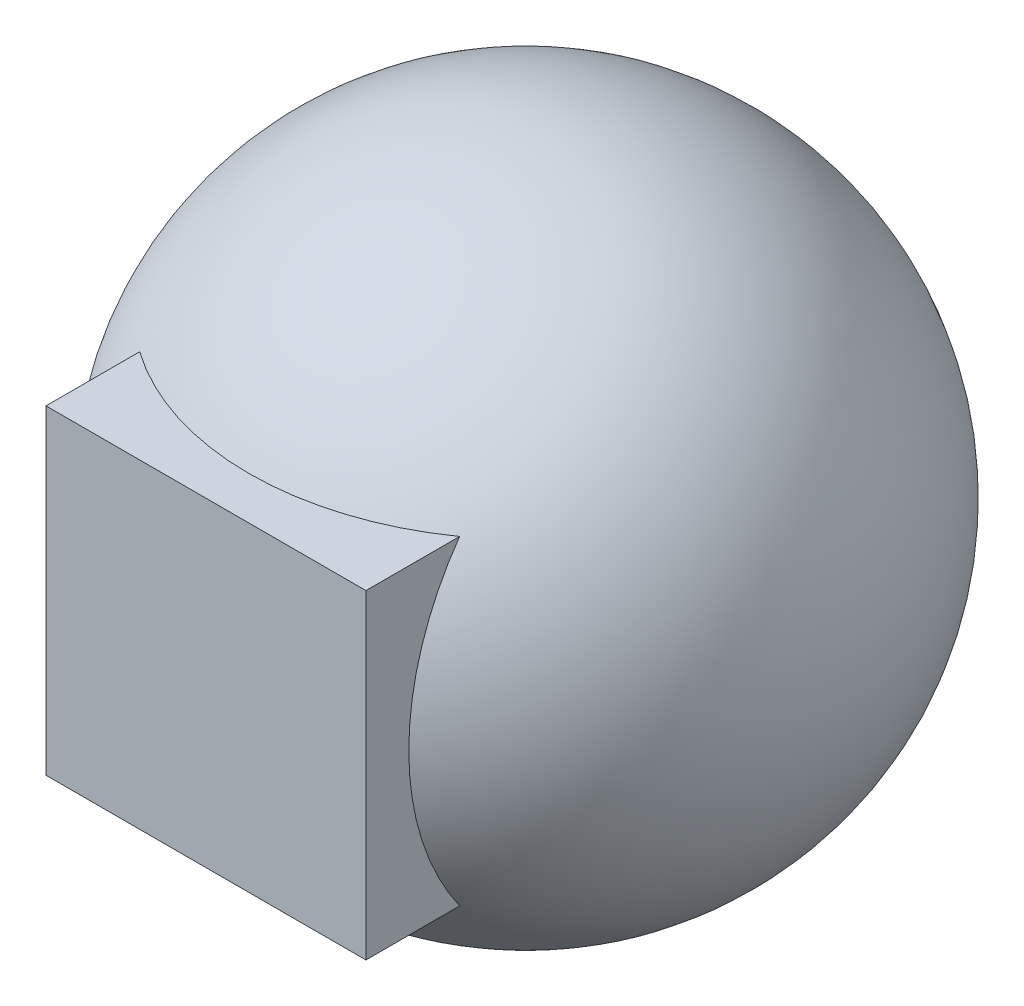
ISO-10303-21;
HEADER;
FILE_DESCRIPTION(('STEP AP214'),'2;1');
FILE_NAME('part.step','',(''),(''),'','','');
FILE_SCHEMA(('AUTOMOTIVE_DESIGN { 1 0 10303 214 1 1 1 1 }'));
ENDSEC;
DATA;
#1=APPLICATION_CONTEXT('core data for automotive mechanical design processes');
#2=APPLICATION_PROTOCOL_DEFINITION('international standard','automotive_design',2000,#1);
#3=PRODUCT_CONTEXT('',#1,'mechanical');
#4=PRODUCT('Part','Part','',(#3));
#5=PRODUCT_RELATED_PRODUCT_CATEGORY('part','',(#4));
#6=PRODUCT_DEFINITION_FORMATION('','',#4);
#7=PRODUCT_DEFINITION_CONTEXT('part definition',#1,'design');
#8=PRODUCT_DEFINITION('design','',#6,#7);
#9=PRODUCT_DEFINITION_SHAPE('','',#8);
#10=(LENGTH_UNIT() NAMED_UNIT(*) SI_UNIT(.MILLI.,.METRE.));
#11=(NAMED_UNIT(*) PLANE_ANGLE_UNIT() SI_UNIT($,.RADIAN.));
#12=(NAMED_UNIT(*) SI_UNIT($,.STERADIAN.) SOLID_ANGLE_UNIT());
#13=UNCERTAINTY_MEASURE_WITH_UNIT(LENGTH_MEASURE(1.E-05),#10,'distance_accuracy_value','');
#14=(GEOMETRIC_REPRESENTATION_CONTEXT(3) GLOBAL_UNCERTAINTY_ASSIGNED_CONTEXT((#13)) GLOBAL_UNIT_ASSIGNED_CONTEXT((#10,
#11,#12)) REPRESENTATION_CONTEXT('',''));
#15=CARTESIAN_POINT('',(0.,0.,0.));
#16=DIRECTION('',(0.,0.,1.));
#17=DIRECTION('',(1.,0.,0.));
#18=AXIS2_PLACEMENT_3D('',#15,#16,#17);
#19=CARTESIAN_POINT('',(10.,-10.,20.));
#20=DIRECTION('',(-1.,0.,0.));
#21=DIRECTION('',(0.,0.,1.));
#22=AXIS2_PLACEMENT_3D('',#19,#20,#21);
#23=PLANE('',#22);
#24=CARTESIAN_POINT('',(10.,0.,0.));
#25=DIRECTION('',(-1.,0.,0.));
#26=DIRECTION('',(0.,0.,1.));
#27=AXIS2_PLACEMENT_3D('',#24,#25,#26);
#28=CIRCLE('',#27,17.3205080756888);
#29=CARTESIAN_POINT('',(10.,10.,14.1421356237309));
#30=VERTEX_POINT('',#29);
#31=CARTESIAN_POINT('',(10.,-10.,14.142135623731));
#32=VERTEX_POINT('',#31);
#33=EDGE_CURVE('E11',#30,#32,#28,.F.);
#34=ORIENTED_EDGE('',*,*,#33,.F.);
#35=DIRECTION('',(0.,0.,-1.));
#36=VECTOR('',#35,1.);
#37=CARTESIAN_POINT('',(10.,10.,20.));
#38=LINE('',#37,#36);
#39=CARTESIAN_POINT('',(10.,10.,20.));
#40=VERTEX_POINT('',#39);
#41=EDGE_CURVE('E78',#40,#30,#38,.T.);
#42=ORIENTED_EDGE('',*,*,#41,.F.);
#43=DIRECTION('',(0.,1.,0.));
#44=VECTOR('',#43,1.);
#45=CARTESIAN_POINT('',(10.,-10.,20.));
#46=LINE('',#45,#44);
#47=CARTESIAN_POINT('',(10.,-10.,20.));
#48=VERTEX_POINT('',#47);
#49=EDGE_CURVE('E85',#48,#40,#46,.T.);
#50=ORIENTED_EDGE('',*,*,#49,.F.);
#51=DIRECTION('',(0.,0.,-1.));
#52=VECTOR('',#51,1.);
#53=CARTESIAN_POINT('',(10.,-10.,20.));
#54=LINE('',#53,#52);
#55=EDGE_CURVE('E107',#48,#32,#54,.T.);
#56=ORIENTED_EDGE('',*,*,#55,.T.);
#57=EDGE_LOOP('',(#34,#42,#50,#56));
#58=FACE_BOUND('',#57,.T.);
#59=ADVANCED_FACE('F32',(#58),#23,.F.);
#60=CARTESIAN_POINT('',(-9.99999999999999,10.,20.));
#61=DIRECTION('',(0.,-1.,0.));
#62=DIRECTION('',(0.,0.,-1.));
#63=AXIS2_PLACEMENT_3D('',#60,#61,#62);
#64=PLANE('',#63);
#65=CARTESIAN_POINT('',(0.,10.,0.));
#66=DIRECTION('',(0.,-1.,0.));
#67=DIRECTION('',(0.,0.,-1.));
#68=AXIS2_PLACEMENT_3D('',#65,#66,#67);
#69=CIRCLE('',#68,17.3205080756888);
#70=CARTESIAN_POINT('',(-9.99999999999999,10.,14.142135623731));
#71=VERTEX_POINT('',#70);
#72=EDGE_CURVE('E40',#71,#30,#69,.F.);
#73=ORIENTED_EDGE('',*,*,#72,.F.);
#74=DIRECTION('',(0.,0.,-1.));
#75=VECTOR('',#74,1.);
#76=CARTESIAN_POINT('',(-9.99999999999999,10.,20.));
#77=LINE('',#76,#75);
#78=CARTESIAN_POINT('',(-9.99999999999999,10.,20.));
#79=VERTEX_POINT('',#78);
#80=EDGE_CURVE('E81',#79,#71,#77,.T.);
#81=ORIENTED_EDGE('',*,*,#80,.F.);
#82=DIRECTION('',(-1.,0.,0.));
#83=VECTOR('',#82,1.);
#84=CARTESIAN_POINT('',(-9.99999999999999,10.,20.));
#85=LINE('',#84,#83);
#86=EDGE_CURVE('E74',#40,#79,#85,.T.);
#87=ORIENTED_EDGE('',*,*,#86,.F.);
#88=ORIENTED_EDGE('',*,*,#41,.T.);
#89=EDGE_LOOP('',(#73,#81,#87,#88));
#90=FACE_BOUND('',#89,.T.);
#91=ADVANCED_FACE('F76',(#90),#64,.F.);
#92=CARTESIAN_POINT('',(-9.99999999999999,-10.,20.));
#93=DIRECTION('',(1.,0.,0.));
#94=DIRECTION('',(0.,0.,-1.));
#95=AXIS2_PLACEMENT_3D('',#92,#93,#94);
#96=PLANE('',#95);
#97=CARTESIAN_POINT('',(-9.99999999999999,0.,0.));
#98=DIRECTION('',(1.,0.,0.));
#99=DIRECTION('',(0.,0.,-1.));
#100=AXIS2_PLACEMENT_3D('',#97,#98,#99);
#101=CIRCLE('',#100,17.3205080756888);
#102=CARTESIAN_POINT('',(-9.99999999999999,-10.,14.142135623731));
#103=VERTEX_POINT('',#102);
#104=EDGE_CURVE('E97',#103,#71,#101,.F.);
#105=ORIENTED_EDGE('',*,*,#104,.F.);
#106=DIRECTION('',(0.,0.,-1.));
#107=VECTOR('',#106,1.);
#108=CARTESIAN_POINT('',(-9.99999999999999,-10.,20.));
#109=LINE('',#108,#107);
#110=CARTESIAN_POINT('',(-9.99999999999999,-10.,20.));
#111=VERTEX_POINT('',#110);
#112=EDGE_CURVE('E47',#111,#103,#109,.T.);
#113=ORIENTED_EDGE('',*,*,#112,.F.);
#114=DIRECTION('',(0.,-1.,0.));
#115=VECTOR('',#114,1.);
#116=CARTESIAN_POINT('',(-9.99999999999999,-10.,20.));
#117=LINE('',#116,#115);
#118=EDGE_CURVE('E84',#79,#111,#117,.T.);
#119=ORIENTED_EDGE('',*,*,#118,.F.);
#120=ORIENTED_EDGE('',*,*,#80,.T.);
#121=EDGE_LOOP('',(#105,#113,#119,#120));
#122=FACE_BOUND('',#121,.T.);
#123=ADVANCED_FACE('F105',(#122),#96,.F.);
#124=CARTESIAN_POINT('',(-9.99999999999999,-10.,20.));
#125=DIRECTION('',(0.,1.,0.));
#126=DIRECTION('',(0.,0.,1.));
#127=AXIS2_PLACEMENT_3D('',#124,#125,#126);
#128=PLANE('',#127);
#129=CARTESIAN_POINT('',(0.,-10.,0.));
#130=DIRECTION('',(0.,1.,0.));
#131=DIRECTION('',(0.,0.,1.));
#132=AXIS2_PLACEMENT_3D('',#129,#130,#131);
#133=CIRCLE('',#132,17.3205080756888);
#134=EDGE_CURVE('E94',#32,#103,#133,.F.);
#135=ORIENTED_EDGE('',*,*,#134,.F.);
#136=ORIENTED_EDGE('',*,*,#55,.F.);
#137=DIRECTION('',(1.,0.,0.));
#138=VECTOR('',#137,1.);
#139=CARTESIAN_POINT('',(-9.99999999999999,-10.,20.));
#140=LINE('',#139,#138);
#141=EDGE_CURVE('E89',#111,#48,#140,.T.);
#142=ORIENTED_EDGE('',*,*,#141,.F.);
#143=ORIENTED_EDGE('',*,*,#112,.T.);
#144=EDGE_LOOP('',(#135,#136,#142,#143));
#145=FACE_BOUND('',#144,.T.);
#146=ADVANCED_FACE('F110',(#145),#128,.F.);
#147=CARTESIAN_POINT('',(0.,0.,20.));
#148=DIRECTION('',(0.,0.,-1.));
#149=DIRECTION('',(-1.,0.,0.));
#150=AXIS2_PLACEMENT_3D('',#147,#148,#149);
#151=PLANE('',#150);
#152=CARTESIAN_POINT('',(0.,0.,20.));
#153=VERTEX_POINT('',#152);
#154=VERTEX_LOOP('',#153);
#155=FACE_BOUND('',#154,.T.);
#156=ORIENTED_EDGE('',*,*,#49,.T.);
#157=ORIENTED_EDGE('',*,*,#86,.T.);
#158=ORIENTED_EDGE('',*,*,#118,.T.);
#159=ORIENTED_EDGE('',*,*,#141,.T.);
#160=EDGE_LOOP('',(#156,#157,#158,#159));
#161=FACE_BOUND('',#160,.T.);
#162=ADVANCED_FACE('F88',(#155,#161),#151,.F.);
#163=CARTESIAN_POINT('',(0.,0.,0.));
#164=DIRECTION('',(0.,-1.,0.));
#165=DIRECTION('',(-1.,0.,0.));
#166=AXIS2_PLACEMENT_3D('',#163,#164,#165);
#167=SPHERICAL_SURFACE('',#166,20.);
#168=ORIENTED_EDGE('',*,*,#72,.T.);
#169=ORIENTED_EDGE('',*,*,#33,.T.);
#170=ORIENTED_EDGE('',*,*,#134,.T.);
#171=ORIENTED_EDGE('',*,*,#104,.T.);
#172=EDGE_LOOP('',(#168,#169,#170,#171));
#173=FACE_BOUND('',#172,.T.);
#174=ADVANCED_FACE('F34',(#173),#167,.T.);
#175=CLOSED_SHELL('',(#59,#91,#123,#146,#162,#174));
#176=MANIFOLD_SOLID_BREP('B2',#175);
#177=ADVANCED_BREP_SHAPE_REPRESENTATION('',(#18,#176),#14);
#178=SHAPE_DEFINITION_REPRESENTATION(#9,#177);
ENDSEC;
END-ISO-10303-21;
